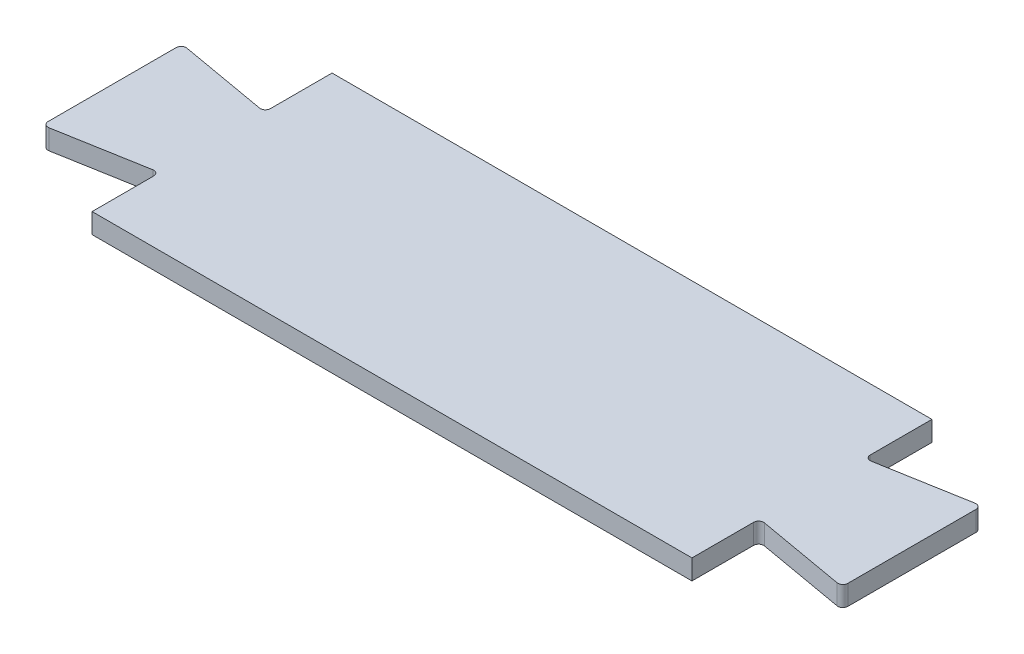
ISO-10303-21;
HEADER;
FILE_DESCRIPTION(('STEP AP214'),'2;1');
FILE_NAME('part.step','',(''),(''),'','','');
FILE_SCHEMA(('AUTOMOTIVE_DESIGN { 1 0 10303 214 1 1 1 1 }'));
ENDSEC;
DATA;
#1=APPLICATION_CONTEXT('core data for automotive mechanical design processes');
#2=APPLICATION_PROTOCOL_DEFINITION('international standard','automotive_design',2000,#1);
#3=PRODUCT_CONTEXT('',#1,'mechanical');
#4=PRODUCT('Part','Part','',(#3));
#5=PRODUCT_RELATED_PRODUCT_CATEGORY('part','',(#4));
#6=PRODUCT_DEFINITION_FORMATION('','',#4);
#7=PRODUCT_DEFINITION_CONTEXT('part definition',#1,'design');
#8=PRODUCT_DEFINITION('design','',#6,#7);
#9=PRODUCT_DEFINITION_SHAPE('','',#8);
#10=(LENGTH_UNIT() NAMED_UNIT(*) SI_UNIT(.MILLI.,.METRE.));
#11=(NAMED_UNIT(*) PLANE_ANGLE_UNIT() SI_UNIT($,.RADIAN.));
#12=(NAMED_UNIT(*) SI_UNIT($,.STERADIAN.) SOLID_ANGLE_UNIT());
#13=UNCERTAINTY_MEASURE_WITH_UNIT(LENGTH_MEASURE(1.E-05),#10,'distance_accuracy_value','');
#14=(GEOMETRIC_REPRESENTATION_CONTEXT(3) GLOBAL_UNCERTAINTY_ASSIGNED_CONTEXT((#13)) GLOBAL_UNIT_ASSIGNED_CONTEXT((#10,
#11,#12)) REPRESENTATION_CONTEXT('',''));
#15=CARTESIAN_POINT('',(0.,0.,0.));
#16=DIRECTION('',(0.,0.,1.));
#17=DIRECTION('',(1.,0.,0.));
#18=AXIS2_PLACEMENT_3D('',#15,#16,#17);
#19=CARTESIAN_POINT('',(15.,1.,-2.61836509645766));
#20=DIRECTION('',(-1.,0.,0.));
#21=DIRECTION('',(0.,0.,1.));
#22=AXIS2_PLACEMENT_3D('',#19,#20,#21);
#23=PLANE('',#22);
#24=DIRECTION('',(0.,0.,-1.));
#25=VECTOR('',#24,1.);
#26=CARTESIAN_POINT('',(15.,1.,-2.61836509645766));
#27=LINE('',#26,#25);
#28=CARTESIAN_POINT('',(15.,1.,-2.91630349460621));
#29=VERTEX_POINT('',#28);
#30=CARTESIAN_POINT('',(15.,1.,-6.));
#31=VERTEX_POINT('',#30);
#32=EDGE_CURVE('E169',#29,#31,#27,.T.);
#33=ORIENTED_EDGE('',*,*,#32,.F.);
#34=DIRECTION('',(0.,-1.,0.));
#35=VECTOR('',#34,1.);
#36=CARTESIAN_POINT('',(15.,0.,-2.91630349460621));
#37=LINE('',#36,#35);
#38=CARTESIAN_POINT('',(15.,0.,-2.91630349460621));
#39=VERTEX_POINT('',#38);
#40=EDGE_CURVE('E236',#29,#39,#37,.T.);
#41=ORIENTED_EDGE('',*,*,#40,.T.);
#42=DIRECTION('',(0.,0.,-1.));
#43=VECTOR('',#42,1.);
#44=CARTESIAN_POINT('',(15.,0.,-2.61836509645766));
#45=LINE('',#44,#43);
#46=CARTESIAN_POINT('',(15.,0.,-6.));
#47=VERTEX_POINT('',#46);
#48=EDGE_CURVE('E194',#39,#47,#45,.T.);
#49=ORIENTED_EDGE('',*,*,#48,.T.);
#50=DIRECTION('',(0.,-1.,0.));
#51=VECTOR('',#50,1.);
#52=CARTESIAN_POINT('',(15.,1.,-6.));
#53=LINE('',#52,#51);
#54=EDGE_CURVE('E187',#31,#47,#53,.T.);
#55=ORIENTED_EDGE('',*,*,#54,.F.);
#56=EDGE_LOOP('',(#33,#41,#49,#55));
#57=FACE_BOUND('',#56,.T.);
#58=ADVANCED_FACE('F33',(#57),#23,.F.);
#59=CARTESIAN_POINT('',(-15.,1.,-6.));
#60=DIRECTION('',(0.,0.,1.));
#61=DIRECTION('',(1.,0.,0.));
#62=AXIS2_PLACEMENT_3D('',#59,#60,#61);
#63=PLANE('',#62);
#64=DIRECTION('',(-1.,0.,0.));
#65=VECTOR('',#64,1.);
#66=CARTESIAN_POINT('',(-15.,0.,-6.));
#67=LINE('',#66,#65);
#68=CARTESIAN_POINT('',(-15.,0.,-6.));
#69=VERTEX_POINT('',#68);
#70=EDGE_CURVE('E305',#47,#69,#67,.T.);
#71=ORIENTED_EDGE('',*,*,#70,.T.);
#72=DIRECTION('',(0.,-1.,0.));
#73=VECTOR('',#72,1.);
#74=CARTESIAN_POINT('',(-15.,1.,-6.));
#75=LINE('',#74,#73);
#76=CARTESIAN_POINT('',(-15.,1.,-6.));
#77=VERTEX_POINT('',#76);
#78=EDGE_CURVE('E189',#77,#69,#75,.T.);
#79=ORIENTED_EDGE('',*,*,#78,.F.);
#80=DIRECTION('',(-1.,0.,0.));
#81=VECTOR('',#80,1.);
#82=CARTESIAN_POINT('',(-15.,1.,-6.));
#83=LINE('',#82,#81);
#84=EDGE_CURVE('E174',#31,#77,#83,.T.);
#85=ORIENTED_EDGE('',*,*,#84,.F.);
#86=ORIENTED_EDGE('',*,*,#54,.T.);
#87=EDGE_LOOP('',(#71,#79,#85,#86));
#88=FACE_BOUND('',#87,.T.);
#89=ADVANCED_FACE('F186',(#88),#63,.F.);
#90=CARTESIAN_POINT('',(-15.,1.,-2.61836509645765));
#91=DIRECTION('',(1.,0.,0.));
#92=DIRECTION('',(0.,0.,-1.));
#93=AXIS2_PLACEMENT_3D('',#90,#91,#92);
#94=PLANE('',#93);
#95=DIRECTION('',(0.,0.,1.));
#96=VECTOR('',#95,1.);
#97=CARTESIAN_POINT('',(-15.,0.,-2.61836509645765));
#98=LINE('',#97,#96);
#99=CARTESIAN_POINT('',(-15.,0.,-2.91630349460621));
#100=VERTEX_POINT('',#99);
#101=EDGE_CURVE('E307',#69,#100,#98,.T.);
#102=ORIENTED_EDGE('',*,*,#101,.T.);
#103=DIRECTION('',(0.,-1.,0.));
#104=VECTOR('',#103,1.);
#105=CARTESIAN_POINT('',(-15.,1.,-2.91630349460621));
#106=LINE('',#105,#104);
#107=CARTESIAN_POINT('',(-15.,1.,-2.91630349460621));
#108=VERTEX_POINT('',#107);
#109=EDGE_CURVE('E234',#100,#108,#106,.F.);
#110=ORIENTED_EDGE('',*,*,#109,.T.);
#111=DIRECTION('',(0.,0.,1.));
#112=VECTOR('',#111,1.);
#113=CARTESIAN_POINT('',(-15.,1.,-2.61836509645765));
#114=LINE('',#113,#112);
#115=EDGE_CURVE('E191',#77,#108,#114,.T.);
#116=ORIENTED_EDGE('',*,*,#115,.F.);
#117=ORIENTED_EDGE('',*,*,#78,.T.);
#118=EDGE_LOOP('',(#102,#110,#116,#117));
#119=FACE_BOUND('',#118,.T.);
#120=ADVANCED_FACE('F393',(#119),#94,.F.);
#121=CARTESIAN_POINT('',(-15.,1.,-2.61836509645765));
#122=DIRECTION('',(-0.173648177666934,0.,0.984807753012207));
#123=DIRECTION('',(0.984807753012208,0.,0.173648177666934));
#124=AXIS2_PLACEMENT_3D('',#121,#122,#123);
#125=PLANE('',#124);
#126=DIRECTION('',(-0.984807753012207,0.,-0.173648177666934));
#127=VECTOR('',#126,1.);
#128=CARTESIAN_POINT('',(-15.,0.,-2.61836509645765));
#129=LINE('',#128,#127);
#130=CARTESIAN_POINT('',(-15.2934120444167,0.,-2.67010155635316));
#131=VERTEX_POINT('',#130);
#132=CARTESIAN_POINT('',(-19.7065879555833,0.,-3.4482635401045));
#133=VERTEX_POINT('',#132);
#134=EDGE_CURVE('E310',#131,#133,#129,.T.);
#135=ORIENTED_EDGE('',*,*,#134,.T.);
#136=DIRECTION('',(0.,-1.,0.));
#137=VECTOR('',#136,1.);
#138=CARTESIAN_POINT('',(-19.7065879555833,1.,-3.4482635401045));
#139=LINE('',#138,#137);
#140=CARTESIAN_POINT('',(-19.7065879555833,1.,-3.4482635401045));
#141=VERTEX_POINT('',#140);
#142=EDGE_CURVE('E232',#133,#141,#139,.F.);
#143=ORIENTED_EDGE('',*,*,#142,.T.);
#144=DIRECTION('',(-0.984807753012207,0.,-0.173648177666934));
#145=VECTOR('',#144,1.);
#146=CARTESIAN_POINT('',(-15.,1.,-2.61836509645765));
#147=LINE('',#146,#145);
#148=CARTESIAN_POINT('',(-15.2934120444167,1.,-2.67010155635316));
#149=VERTEX_POINT('',#148);
#150=EDGE_CURVE('E352',#149,#141,#147,.T.);
#151=ORIENTED_EDGE('',*,*,#150,.F.);
#152=DIRECTION('',(0.,-1.,0.));
#153=VECTOR('',#152,1.);
#154=CARTESIAN_POINT('',(-15.2934120444167,0.,-2.67010155635316));
#155=LINE('',#154,#153);
#156=EDGE_CURVE('E229',#149,#131,#155,.T.);
#157=ORIENTED_EDGE('',*,*,#156,.T.);
#158=EDGE_LOOP('',(#135,#143,#151,#157));
#159=FACE_BOUND('',#158,.T.);
#160=ADVANCED_FACE('F366',(#159),#125,.F.);
#161=CARTESIAN_POINT('',(-20.,1.,-3.5));
#162=DIRECTION('',(1.,0.,0.));
#163=DIRECTION('',(0.,0.,-1.));
#164=AXIS2_PLACEMENT_3D('',#161,#162,#163);
#165=PLANE('',#164);
#166=DIRECTION('',(0.,0.,1.));
#167=VECTOR('',#166,1.);
#168=CARTESIAN_POINT('',(-20.,0.,-3.5));
#169=LINE('',#168,#167);
#170=CARTESIAN_POINT('',(-20.,0.,-3.20206160185145));
#171=VERTEX_POINT('',#170);
#172=CARTESIAN_POINT('',(-20.,0.,3.20206160185145));
#173=VERTEX_POINT('',#172);
#174=EDGE_CURVE('E313',#171,#173,#169,.T.);
#175=ORIENTED_EDGE('',*,*,#174,.T.);
#176=DIRECTION('',(0.,-1.,0.));
#177=VECTOR('',#176,1.);
#178=CARTESIAN_POINT('',(-20.,1.,3.20206160185145));
#179=LINE('',#178,#177);
#180=CARTESIAN_POINT('',(-20.,1.,3.20206160185145));
#181=VERTEX_POINT('',#180);
#182=EDGE_CURVE('E220',#173,#181,#179,.F.);
#183=ORIENTED_EDGE('',*,*,#182,.T.);
#184=DIRECTION('',(0.,0.,1.));
#185=VECTOR('',#184,1.);
#186=CARTESIAN_POINT('',(-20.,1.,-3.5));
#187=LINE('',#186,#185);
#188=CARTESIAN_POINT('',(-20.,1.,-3.20206160185145));
#189=VERTEX_POINT('',#188);
#190=EDGE_CURVE('E349',#189,#181,#187,.T.);
#191=ORIENTED_EDGE('',*,*,#190,.F.);
#192=DIRECTION('',(0.,-1.,0.));
#193=VECTOR('',#192,1.);
#194=CARTESIAN_POINT('',(-20.,1.,-3.20206160185145));
#195=LINE('',#194,#193);
#196=EDGE_CURVE('E217',#189,#171,#195,.T.);
#197=ORIENTED_EDGE('',*,*,#196,.T.);
#198=EDGE_LOOP('',(#175,#183,#191,#197));
#199=FACE_BOUND('',#198,.T.);
#200=ADVANCED_FACE('F376',(#199),#165,.F.);
#201=CARTESIAN_POINT('',(-15.,1.,2.61836509645765));
#202=DIRECTION('',(-0.173648177666935,0.,-0.984807753012207));
#203=DIRECTION('',(-0.984807753012207,0.,0.173648177666935));
#204=AXIS2_PLACEMENT_3D('',#201,#202,#203);
#205=PLANE('',#204);
#206=DIRECTION('',(0.984807753012207,0.,-0.173648177666935));
#207=VECTOR('',#206,1.);
#208=CARTESIAN_POINT('',(-15.,0.,2.61836509645765));
#209=LINE('',#208,#207);
#210=CARTESIAN_POINT('',(-19.7065879555833,0.,3.4482635401045));
#211=VERTEX_POINT('',#210);
#212=CARTESIAN_POINT('',(-15.2934120444167,0.,2.67010155635316));
#213=VERTEX_POINT('',#212);
#214=EDGE_CURVE('E316',#211,#213,#209,.T.);
#215=ORIENTED_EDGE('',*,*,#214,.T.);
#216=DIRECTION('',(0.,-1.,0.));
#217=VECTOR('',#216,1.);
#218=CARTESIAN_POINT('',(-15.2934120444167,1.,2.67010155635316));
#219=LINE('',#218,#217);
#220=CARTESIAN_POINT('',(-15.2934120444167,1.,2.67010155635316));
#221=VERTEX_POINT('',#220);
#222=EDGE_CURVE('E207',#213,#221,#219,.F.);
#223=ORIENTED_EDGE('',*,*,#222,.T.);
#224=DIRECTION('',(0.984807753012207,0.,-0.173648177666935));
#225=VECTOR('',#224,1.);
#226=CARTESIAN_POINT('',(-15.,1.,2.61836509645765));
#227=LINE('',#226,#225);
#228=CARTESIAN_POINT('',(-19.7065879555833,1.,3.4482635401045));
#229=VERTEX_POINT('',#228);
#230=EDGE_CURVE('E346',#229,#221,#227,.T.);
#231=ORIENTED_EDGE('',*,*,#230,.F.);
#232=DIRECTION('',(0.,-1.,0.));
#233=VECTOR('',#232,1.);
#234=CARTESIAN_POINT('',(-19.7065879555833,1.,3.4482635401045));
#235=LINE('',#234,#233);
#236=EDGE_CURVE('E199',#229,#211,#235,.T.);
#237=ORIENTED_EDGE('',*,*,#236,.T.);
#238=EDGE_LOOP('',(#215,#223,#231,#237));
#239=FACE_BOUND('',#238,.T.);
#240=ADVANCED_FACE('F345',(#239),#205,.F.);
#241=CARTESIAN_POINT('',(-15.,1.,6.));
#242=DIRECTION('',(1.,0.,0.));
#243=DIRECTION('',(0.,0.,-1.));
#244=AXIS2_PLACEMENT_3D('',#241,#242,#243);
#245=PLANE('',#244);
#246=DIRECTION('',(0.,0.,1.));
#247=VECTOR('',#246,1.);
#248=CARTESIAN_POINT('',(-15.,1.,6.));
#249=LINE('',#248,#247);
#250=CARTESIAN_POINT('',(-15.,1.,2.91630349460621));
#251=VERTEX_POINT('',#250);
#252=CARTESIAN_POINT('',(-15.,1.,6.));
#253=VERTEX_POINT('',#252);
#254=EDGE_CURVE('E337',#251,#253,#249,.T.);
#255=ORIENTED_EDGE('',*,*,#254,.F.);
#256=DIRECTION('',(0.,-1.,0.));
#257=VECTOR('',#256,1.);
#258=CARTESIAN_POINT('',(-15.,0.,2.91630349460621));
#259=LINE('',#258,#257);
#260=CARTESIAN_POINT('',(-15.,0.,2.91630349460621));
#261=VERTEX_POINT('',#260);
#262=EDGE_CURVE('E196',#251,#261,#259,.T.);
#263=ORIENTED_EDGE('',*,*,#262,.T.);
#264=DIRECTION('',(0.,0.,1.));
#265=VECTOR('',#264,1.);
#266=CARTESIAN_POINT('',(-15.,0.,6.));
#267=LINE('',#266,#265);
#268=CARTESIAN_POINT('',(-15.,0.,6.));
#269=VERTEX_POINT('',#268);
#270=EDGE_CURVE('E319',#261,#269,#267,.T.);
#271=ORIENTED_EDGE('',*,*,#270,.T.);
#272=DIRECTION('',(0.,-1.,0.));
#273=VECTOR('',#272,1.);
#274=CARTESIAN_POINT('',(-15.,1.,6.));
#275=LINE('',#274,#273);
#276=EDGE_CURVE('E201',#253,#269,#275,.T.);
#277=ORIENTED_EDGE('',*,*,#276,.F.);
#278=EDGE_LOOP('',(#255,#263,#271,#277));
#279=FACE_BOUND('',#278,.T.);
#280=ADVANCED_FACE('F335',(#279),#245,.F.);
#281=CARTESIAN_POINT('',(-15.,1.,6.));
#282=DIRECTION('',(0.,0.,-1.));
#283=DIRECTION('',(-1.,0.,0.));
#284=AXIS2_PLACEMENT_3D('',#281,#282,#283);
#285=PLANE('',#284);
#286=DIRECTION('',(1.,0.,0.));
#287=VECTOR('',#286,1.);
#288=CARTESIAN_POINT('',(-15.,0.,6.));
#289=LINE('',#288,#287);
#290=CARTESIAN_POINT('',(15.,0.,6.));
#291=VERTEX_POINT('',#290);
#292=EDGE_CURVE('E284',#269,#291,#289,.T.);
#293=ORIENTED_EDGE('',*,*,#292,.T.);
#294=DIRECTION('',(0.,-1.,0.));
#295=VECTOR('',#294,1.);
#296=CARTESIAN_POINT('',(15.,1.,6.));
#297=LINE('',#296,#295);
#298=CARTESIAN_POINT('',(15.,1.,6.));
#299=VERTEX_POINT('',#298);
#300=EDGE_CURVE('E283',#299,#291,#297,.T.);
#301=ORIENTED_EDGE('',*,*,#300,.F.);
#302=DIRECTION('',(1.,0.,0.));
#303=VECTOR('',#302,1.);
#304=CARTESIAN_POINT('',(-15.,1.,6.));
#305=LINE('',#304,#303);
#306=EDGE_CURVE('E299',#253,#299,#305,.T.);
#307=ORIENTED_EDGE('',*,*,#306,.F.);
#308=ORIENTED_EDGE('',*,*,#276,.T.);
#309=EDGE_LOOP('',(#293,#301,#307,#308));
#310=FACE_BOUND('',#309,.T.);
#311=ADVANCED_FACE('F331',(#310),#285,.F.);
#312=CARTESIAN_POINT('',(15.,1.,6.));
#313=DIRECTION('',(-1.,0.,0.));
#314=DIRECTION('',(0.,0.,1.));
#315=AXIS2_PLACEMENT_3D('',#312,#313,#314);
#316=PLANE('',#315);
#317=DIRECTION('',(0.,0.,-1.));
#318=VECTOR('',#317,1.);
#319=CARTESIAN_POINT('',(15.,0.,6.));
#320=LINE('',#319,#318);
#321=CARTESIAN_POINT('',(15.,0.,2.91630349460621));
#322=VERTEX_POINT('',#321);
#323=EDGE_CURVE('E271',#291,#322,#320,.T.);
#324=ORIENTED_EDGE('',*,*,#323,.T.);
#325=DIRECTION('',(0.,-1.,0.));
#326=VECTOR('',#325,1.);
#327=CARTESIAN_POINT('',(15.,1.,2.91630349460621));
#328=LINE('',#327,#326);
#329=CARTESIAN_POINT('',(15.,1.,2.91630349460621));
#330=VERTEX_POINT('',#329);
#331=EDGE_CURVE('E252',#322,#330,#328,.F.);
#332=ORIENTED_EDGE('',*,*,#331,.T.);
#333=DIRECTION('',(0.,0.,-1.));
#334=VECTOR('',#333,1.);
#335=CARTESIAN_POINT('',(15.,1.,6.));
#336=LINE('',#335,#334);
#337=EDGE_CURVE('E291',#299,#330,#336,.T.);
#338=ORIENTED_EDGE('',*,*,#337,.F.);
#339=ORIENTED_EDGE('',*,*,#300,.T.);
#340=EDGE_LOOP('',(#324,#332,#338,#339));
#341=FACE_BOUND('',#340,.T.);
#342=ADVANCED_FACE('F279',(#341),#316,.F.);
#343=CARTESIAN_POINT('',(15.,1.,2.61836509645765));
#344=DIRECTION('',(0.173648177666935,0.,-0.984807753012207));
#345=DIRECTION('',(-0.984807753012207,0.,-0.173648177666935));
#346=AXIS2_PLACEMENT_3D('',#343,#344,#345);
#347=PLANE('',#346);
#348=DIRECTION('',(0.984807753012207,0.,0.173648177666935));
#349=VECTOR('',#348,1.);
#350=CARTESIAN_POINT('',(15.,0.,2.61836509645765));
#351=LINE('',#350,#349);
#352=CARTESIAN_POINT('',(15.2934120444167,0.,2.67010155635316));
#353=VERTEX_POINT('',#352);
#354=CARTESIAN_POINT('',(19.7065879555833,0.,3.4482635401045));
#355=VERTEX_POINT('',#354);
#356=EDGE_CURVE('E273',#353,#355,#351,.T.);
#357=ORIENTED_EDGE('',*,*,#356,.T.);
#358=DIRECTION('',(0.,-1.,0.));
#359=VECTOR('',#358,1.);
#360=CARTESIAN_POINT('',(19.7065879555833,1.,3.4482635401045));
#361=LINE('',#360,#359);
#362=CARTESIAN_POINT('',(19.7065879555833,1.,3.4482635401045));
#363=VERTEX_POINT('',#362);
#364=EDGE_CURVE('E250',#355,#363,#361,.F.);
#365=ORIENTED_EDGE('',*,*,#364,.T.);
#366=DIRECTION('',(0.984807753012207,0.,0.173648177666935));
#367=VECTOR('',#366,1.);
#368=CARTESIAN_POINT('',(15.,1.,2.61836509645765));
#369=LINE('',#368,#367);
#370=CARTESIAN_POINT('',(15.2934120444167,1.,2.67010155635316));
#371=VERTEX_POINT('',#370);
#372=EDGE_CURVE('E289',#371,#363,#369,.T.);
#373=ORIENTED_EDGE('',*,*,#372,.F.);
#374=DIRECTION('',(0.,-1.,0.));
#375=VECTOR('',#374,1.);
#376=CARTESIAN_POINT('',(15.2934120444167,0.,2.67010155635316));
#377=LINE('',#376,#375);
#378=EDGE_CURVE('E247',#371,#353,#377,.T.);
#379=ORIENTED_EDGE('',*,*,#378,.T.);
#380=EDGE_LOOP('',(#357,#365,#373,#379));
#381=FACE_BOUND('',#380,.T.);
#382=ADVANCED_FACE('F293',(#381),#347,.F.);
#383=CARTESIAN_POINT('',(20.,1.,-3.50000000000001));
#384=DIRECTION('',(-1.,0.,0.));
#385=DIRECTION('',(0.,0.,1.));
#386=AXIS2_PLACEMENT_3D('',#383,#384,#385);
#387=PLANE('',#386);
#388=DIRECTION('',(0.,0.,-1.));
#389=VECTOR('',#388,1.);
#390=CARTESIAN_POINT('',(20.,0.,-3.50000000000001));
#391=LINE('',#390,#389);
#392=CARTESIAN_POINT('',(20.,0.,3.20206160185145));
#393=VERTEX_POINT('',#392);
#394=CARTESIAN_POINT('',(20.,0.,-3.20206160185145));
#395=VERTEX_POINT('',#394);
#396=EDGE_CURVE('E323',#393,#395,#391,.T.);
#397=ORIENTED_EDGE('',*,*,#396,.T.);
#398=DIRECTION('',(0.,-1.,0.));
#399=VECTOR('',#398,1.);
#400=CARTESIAN_POINT('',(20.,1.,-3.20206160185145));
#401=LINE('',#400,#399);
#402=CARTESIAN_POINT('',(20.,1.,-3.20206160185145));
#403=VERTEX_POINT('',#402);
#404=EDGE_CURVE('E245',#395,#403,#401,.F.);
#405=ORIENTED_EDGE('',*,*,#404,.T.);
#406=DIRECTION('',(0.,0.,-1.));
#407=VECTOR('',#406,1.);
#408=CARTESIAN_POINT('',(20.,1.,-3.50000000000001));
#409=LINE('',#408,#407);
#410=CARTESIAN_POINT('',(20.,1.,3.20206160185145));
#411=VERTEX_POINT('',#410);
#412=EDGE_CURVE('E295',#411,#403,#409,.T.);
#413=ORIENTED_EDGE('',*,*,#412,.F.);
#414=DIRECTION('',(0.,-1.,0.));
#415=VECTOR('',#414,1.);
#416=CARTESIAN_POINT('',(20.,1.,3.20206160185145));
#417=LINE('',#416,#415);
#418=EDGE_CURVE('E242',#411,#393,#417,.T.);
#419=ORIENTED_EDGE('',*,*,#418,.T.);
#420=EDGE_LOOP('',(#397,#405,#413,#419));
#421=FACE_BOUND('',#420,.T.);
#422=ADVANCED_FACE('F412',(#421),#387,.F.);
#423=CARTESIAN_POINT('',(15.,1.,-2.61836509645766));
#424=DIRECTION('',(0.173648177666935,0.,0.984807753012207));
#425=DIRECTION('',(0.984807753012207,0.,-0.173648177666935));
#426=AXIS2_PLACEMENT_3D('',#423,#424,#425);
#427=PLANE('',#426);
#428=DIRECTION('',(-0.984807753012207,0.,0.173648177666935));
#429=VECTOR('',#428,1.);
#430=CARTESIAN_POINT('',(15.,0.,-2.61836509645766));
#431=LINE('',#430,#429);
#432=CARTESIAN_POINT('',(19.7065879555833,0.,-3.44826354010451));
#433=VERTEX_POINT('',#432);
#434=CARTESIAN_POINT('',(15.2934120444167,0.,-2.67010155635316));
#435=VERTEX_POINT('',#434);
#436=EDGE_CURVE('E182',#433,#435,#431,.T.);
#437=ORIENTED_EDGE('',*,*,#436,.T.);
#438=DIRECTION('',(0.,-1.,0.));
#439=VECTOR('',#438,1.);
#440=CARTESIAN_POINT('',(15.2934120444167,1.,-2.67010155635316));
#441=LINE('',#440,#439);
#442=CARTESIAN_POINT('',(15.2934120444167,1.,-2.67010155635316));
#443=VERTEX_POINT('',#442);
#444=EDGE_CURVE('E48',#435,#443,#441,.F.);
#445=ORIENTED_EDGE('',*,*,#444,.T.);
#446=DIRECTION('',(-0.984807753012207,0.,0.173648177666935));
#447=VECTOR('',#446,1.);
#448=CARTESIAN_POINT('',(15.,1.,-2.61836509645766));
#449=LINE('',#448,#447);
#450=CARTESIAN_POINT('',(19.7065879555833,1.,-3.44826354010451));
#451=VERTEX_POINT('',#450);
#452=EDGE_CURVE('E297',#451,#443,#449,.T.);
#453=ORIENTED_EDGE('',*,*,#452,.F.);
#454=DIRECTION('',(0.,-1.,0.));
#455=VECTOR('',#454,1.);
#456=CARTESIAN_POINT('',(19.7065879555833,1.,-3.44826354010451));
#457=LINE('',#456,#455);
#458=EDGE_CURVE('E238',#451,#433,#457,.T.);
#459=ORIENTED_EDGE('',*,*,#458,.T.);
#460=EDGE_LOOP('',(#437,#445,#453,#459));
#461=FACE_BOUND('',#460,.T.);
#462=ADVANCED_FACE('F415',(#461),#427,.F.);
#463=CARTESIAN_POINT('',(0.,1.,0.));
#464=DIRECTION('',(0.,-1.,0.));
#465=DIRECTION('',(0.,0.,-1.));
#466=AXIS2_PLACEMENT_3D('',#463,#464,#465);
#467=PLANE('',#466);
#468=ORIENTED_EDGE('',*,*,#190,.T.);
#469=CARTESIAN_POINT('',(-19.75,1.,3.20206160185145));
#470=DIRECTION('',(0.,-1.,0.));
#471=DIRECTION('',(0.,0.,-1.));
#472=AXIS2_PLACEMENT_3D('',#469,#470,#471);
#473=CIRCLE('',#472,0.25);
#474=EDGE_CURVE('E227',#181,#229,#473,.F.);
#475=ORIENTED_EDGE('',*,*,#474,.T.);
#476=ORIENTED_EDGE('',*,*,#230,.T.);
#477=CARTESIAN_POINT('',(-15.25,1.,2.91630349460621));
#478=DIRECTION('',(0.,-1.,0.));
#479=DIRECTION('',(0.,0.,-1.));
#480=AXIS2_PLACEMENT_3D('',#477,#478,#479);
#481=CIRCLE('',#480,0.25);
#482=EDGE_CURVE('E256',#221,#251,#481,.T.);
#483=ORIENTED_EDGE('',*,*,#482,.T.);
#484=ORIENTED_EDGE('',*,*,#254,.T.);
#485=ORIENTED_EDGE('',*,*,#306,.T.);
#486=ORIENTED_EDGE('',*,*,#337,.T.);
#487=CARTESIAN_POINT('',(15.25,1.,2.91630349460621));
#488=DIRECTION('',(0.,-1.,0.));
#489=DIRECTION('',(0.,0.,-1.));
#490=AXIS2_PLACEMENT_3D('',#487,#488,#489);
#491=CIRCLE('',#490,0.25);
#492=EDGE_CURVE('E11',#330,#371,#491,.T.);
#493=ORIENTED_EDGE('',*,*,#492,.T.);
#494=ORIENTED_EDGE('',*,*,#372,.T.);
#495=CARTESIAN_POINT('',(19.75,1.,3.20206160185145));
#496=DIRECTION('',(0.,-1.,0.));
#497=DIRECTION('',(0.,0.,-1.));
#498=AXIS2_PLACEMENT_3D('',#495,#496,#497);
#499=CIRCLE('',#498,0.25);
#500=EDGE_CURVE('E222',#363,#411,#499,.F.);
#501=ORIENTED_EDGE('',*,*,#500,.T.);
#502=ORIENTED_EDGE('',*,*,#412,.T.);
#503=CARTESIAN_POINT('',(19.75,1.,-3.20206160185145));
#504=DIRECTION('',(0.,-1.,0.));
#505=DIRECTION('',(0.,0.,-1.));
#506=AXIS2_PLACEMENT_3D('',#503,#504,#505);
#507=CIRCLE('',#506,0.25);
#508=EDGE_CURVE('E55',#403,#451,#507,.F.);
#509=ORIENTED_EDGE('',*,*,#508,.T.);
#510=ORIENTED_EDGE('',*,*,#452,.T.);
#511=CARTESIAN_POINT('',(15.25,1.,-2.91630349460621));
#512=DIRECTION('',(0.,-1.,0.));
#513=DIRECTION('',(0.,0.,-1.));
#514=AXIS2_PLACEMENT_3D('',#511,#512,#513);
#515=CIRCLE('',#514,0.25);
#516=EDGE_CURVE('E177',#443,#29,#515,.T.);
#517=ORIENTED_EDGE('',*,*,#516,.T.);
#518=ORIENTED_EDGE('',*,*,#32,.T.);
#519=ORIENTED_EDGE('',*,*,#84,.T.);
#520=ORIENTED_EDGE('',*,*,#115,.T.);
#521=CARTESIAN_POINT('',(-15.25,1.,-2.91630349460621));
#522=DIRECTION('',(0.,-1.,0.));
#523=DIRECTION('',(0.,0.,-1.));
#524=AXIS2_PLACEMENT_3D('',#521,#522,#523);
#525=CIRCLE('',#524,0.25);
#526=EDGE_CURVE('E260',#108,#149,#525,.T.);
#527=ORIENTED_EDGE('',*,*,#526,.T.);
#528=ORIENTED_EDGE('',*,*,#150,.T.);
#529=CARTESIAN_POINT('',(-19.75,1.,-3.20206160185145));
#530=DIRECTION('',(0.,-1.,0.));
#531=DIRECTION('',(0.,0.,-1.));
#532=AXIS2_PLACEMENT_3D('',#529,#530,#531);
#533=CIRCLE('',#532,0.25);
#534=EDGE_CURVE('E225',#141,#189,#533,.F.);
#535=ORIENTED_EDGE('',*,*,#534,.T.);
#536=EDGE_LOOP('',(#468,#475,#476,#483,#484,#485,#486,#493,#494,#501,#502,#509,#510,#517,#518,
#519,#520,#527,#528,#535));
#537=FACE_BOUND('',#536,.T.);
#538=ADVANCED_FACE('F172',(#537),#467,.F.);
#539=CARTESIAN_POINT('',(0.,0.,0.));
#540=DIRECTION('',(0.,-1.,0.));
#541=DIRECTION('',(0.,0.,-1.));
#542=AXIS2_PLACEMENT_3D('',#539,#540,#541);
#543=PLANE('',#542);
#544=ORIENTED_EDGE('',*,*,#214,.F.);
#545=CARTESIAN_POINT('',(-19.75,0.,3.20206160185145));
#546=DIRECTION('',(0.,-1.,0.));
#547=DIRECTION('',(0.,0.,-1.));
#548=AXIS2_PLACEMENT_3D('',#545,#546,#547);
#549=CIRCLE('',#548,0.25);
#550=EDGE_CURVE('E215',#211,#173,#549,.T.);
#551=ORIENTED_EDGE('',*,*,#550,.T.);
#552=ORIENTED_EDGE('',*,*,#174,.F.);
#553=CARTESIAN_POINT('',(-19.75,0.,-3.20206160185145));
#554=DIRECTION('',(0.,-1.,0.));
#555=DIRECTION('',(0.,0.,-1.));
#556=AXIS2_PLACEMENT_3D('',#553,#554,#555);
#557=CIRCLE('',#556,0.25);
#558=EDGE_CURVE('E213',#171,#133,#557,.T.);
#559=ORIENTED_EDGE('',*,*,#558,.T.);
#560=ORIENTED_EDGE('',*,*,#134,.F.);
#561=CARTESIAN_POINT('',(-15.25,0.,-2.91630349460621));
#562=DIRECTION('',(0.,-1.,0.));
#563=DIRECTION('',(0.,0.,-1.));
#564=AXIS2_PLACEMENT_3D('',#561,#562,#563);
#565=CIRCLE('',#564,0.25);
#566=EDGE_CURVE('E258',#131,#100,#565,.F.);
#567=ORIENTED_EDGE('',*,*,#566,.T.);
#568=ORIENTED_EDGE('',*,*,#101,.F.);
#569=ORIENTED_EDGE('',*,*,#70,.F.);
#570=ORIENTED_EDGE('',*,*,#48,.F.);
#571=CARTESIAN_POINT('',(15.25,0.,-2.91630349460621));
#572=DIRECTION('',(0.,-1.,0.));
#573=DIRECTION('',(0.,0.,-1.));
#574=AXIS2_PLACEMENT_3D('',#571,#572,#573);
#575=CIRCLE('',#574,0.25);
#576=EDGE_CURVE('E262',#39,#435,#575,.F.);
#577=ORIENTED_EDGE('',*,*,#576,.T.);
#578=ORIENTED_EDGE('',*,*,#436,.F.);
#579=CARTESIAN_POINT('',(19.75,0.,-3.20206160185145));
#580=DIRECTION('',(0.,-1.,0.));
#581=DIRECTION('',(0.,0.,-1.));
#582=AXIS2_PLACEMENT_3D('',#579,#580,#581);
#583=CIRCLE('',#582,0.25);
#584=EDGE_CURVE('E211',#433,#395,#583,.T.);
#585=ORIENTED_EDGE('',*,*,#584,.T.);
#586=ORIENTED_EDGE('',*,*,#396,.F.);
#587=CARTESIAN_POINT('',(19.75,0.,3.20206160185145));
#588=DIRECTION('',(0.,-1.,0.));
#589=DIRECTION('',(0.,0.,-1.));
#590=AXIS2_PLACEMENT_3D('',#587,#588,#589);
#591=CIRCLE('',#590,0.25);
#592=EDGE_CURVE('E209',#393,#355,#591,.T.);
#593=ORIENTED_EDGE('',*,*,#592,.T.);
#594=ORIENTED_EDGE('',*,*,#356,.F.);
#595=CARTESIAN_POINT('',(15.25,0.,2.91630349460621));
#596=DIRECTION('',(0.,-1.,0.));
#597=DIRECTION('',(0.,0.,-1.));
#598=AXIS2_PLACEMENT_3D('',#595,#596,#597);
#599=CIRCLE('',#598,0.25);
#600=EDGE_CURVE('E41',#353,#322,#599,.F.);
#601=ORIENTED_EDGE('',*,*,#600,.T.);
#602=ORIENTED_EDGE('',*,*,#323,.F.);
#603=ORIENTED_EDGE('',*,*,#292,.F.);
#604=ORIENTED_EDGE('',*,*,#270,.F.);
#605=CARTESIAN_POINT('',(-15.25,0.,2.91630349460621));
#606=DIRECTION('',(0.,-1.,0.));
#607=DIRECTION('',(0.,0.,-1.));
#608=AXIS2_PLACEMENT_3D('',#605,#606,#607);
#609=CIRCLE('',#608,0.25);
#610=EDGE_CURVE('E254',#261,#213,#609,.F.);
#611=ORIENTED_EDGE('',*,*,#610,.T.);
#612=EDGE_LOOP('',(#544,#551,#552,#559,#560,#567,#568,#569,#570,#577,#578,#585,#586,#593,#594,
#601,#602,#603,#604,#611));
#613=FACE_BOUND('',#612,.T.);
#614=ADVANCED_FACE('F269',(#613),#543,.T.);
#615=CARTESIAN_POINT('',(-15.25,1.,2.91630349460621));
#616=DIRECTION('',(0.,1.,0.));
#617=DIRECTION('',(0.,0.,1.));
#618=AXIS2_PLACEMENT_3D('',#615,#616,#617);
#619=CYLINDRICAL_SURFACE('',#618,0.25);
#620=ORIENTED_EDGE('',*,*,#482,.F.);
#621=ORIENTED_EDGE('',*,*,#222,.F.);
#622=ORIENTED_EDGE('',*,*,#610,.F.);
#623=ORIENTED_EDGE('',*,*,#262,.F.);
#624=EDGE_LOOP('',(#620,#621,#622,#623));
#625=FACE_BOUND('',#624,.T.);
#626=ADVANCED_FACE('F340',(#625),#619,.F.);
#627=CARTESIAN_POINT('',(-19.75,1.,3.20206160185145));
#628=DIRECTION('',(0.,-1.,0.));
#629=DIRECTION('',(0.,0.,-1.));
#630=AXIS2_PLACEMENT_3D('',#627,#628,#629);
#631=CYLINDRICAL_SURFACE('',#630,0.25);
#632=ORIENTED_EDGE('',*,*,#474,.F.);
#633=ORIENTED_EDGE('',*,*,#182,.F.);
#634=ORIENTED_EDGE('',*,*,#550,.F.);
#635=ORIENTED_EDGE('',*,*,#236,.F.);
#636=EDGE_LOOP('',(#632,#633,#634,#635));
#637=FACE_BOUND('',#636,.T.);
#638=ADVANCED_FACE('F379',(#637),#631,.T.);
#639=CARTESIAN_POINT('',(-19.75,1.,-3.20206160185145));
#640=DIRECTION('',(0.,-1.,0.));
#641=DIRECTION('',(0.,0.,-1.));
#642=AXIS2_PLACEMENT_3D('',#639,#640,#641);
#643=CYLINDRICAL_SURFACE('',#642,0.25);
#644=ORIENTED_EDGE('',*,*,#534,.F.);
#645=ORIENTED_EDGE('',*,*,#142,.F.);
#646=ORIENTED_EDGE('',*,*,#558,.F.);
#647=ORIENTED_EDGE('',*,*,#196,.F.);
#648=EDGE_LOOP('',(#644,#645,#646,#647));
#649=FACE_BOUND('',#648,.T.);
#650=ADVANCED_FACE('F373',(#649),#643,.T.);
#651=CARTESIAN_POINT('',(-15.25,1.,-2.91630349460621));
#652=DIRECTION('',(0.,1.,0.));
#653=DIRECTION('',(0.,0.,1.));
#654=AXIS2_PLACEMENT_3D('',#651,#652,#653);
#655=CYLINDRICAL_SURFACE('',#654,0.25);
#656=ORIENTED_EDGE('',*,*,#526,.F.);
#657=ORIENTED_EDGE('',*,*,#109,.F.);
#658=ORIENTED_EDGE('',*,*,#566,.F.);
#659=ORIENTED_EDGE('',*,*,#156,.F.);
#660=EDGE_LOOP('',(#656,#657,#658,#659));
#661=FACE_BOUND('',#660,.T.);
#662=ADVANCED_FACE('F363',(#661),#655,.F.);
#663=CARTESIAN_POINT('',(15.25,1.,-2.91630349460621));
#664=DIRECTION('',(0.,1.,0.));
#665=DIRECTION('',(0.,0.,1.));
#666=AXIS2_PLACEMENT_3D('',#663,#664,#665);
#667=CYLINDRICAL_SURFACE('',#666,0.25);
#668=ORIENTED_EDGE('',*,*,#516,.F.);
#669=ORIENTED_EDGE('',*,*,#444,.F.);
#670=ORIENTED_EDGE('',*,*,#576,.F.);
#671=ORIENTED_EDGE('',*,*,#40,.F.);
#672=EDGE_LOOP('',(#668,#669,#670,#671));
#673=FACE_BOUND('',#672,.T.);
#674=ADVANCED_FACE('F453',(#673),#667,.F.);
#675=CARTESIAN_POINT('',(19.75,1.,-3.20206160185145));
#676=DIRECTION('',(0.,-1.,0.));
#677=DIRECTION('',(0.,0.,-1.));
#678=AXIS2_PLACEMENT_3D('',#675,#676,#677);
#679=CYLINDRICAL_SURFACE('',#678,0.25);
#680=ORIENTED_EDGE('',*,*,#508,.F.);
#681=ORIENTED_EDGE('',*,*,#404,.F.);
#682=ORIENTED_EDGE('',*,*,#584,.F.);
#683=ORIENTED_EDGE('',*,*,#458,.F.);
#684=EDGE_LOOP('',(#680,#681,#682,#683));
#685=FACE_BOUND('',#684,.T.);
#686=ADVANCED_FACE('F462',(#685),#679,.T.);
#687=CARTESIAN_POINT('',(19.75,1.,3.20206160185145));
#688=DIRECTION('',(0.,-1.,0.));
#689=DIRECTION('',(0.,0.,-1.));
#690=AXIS2_PLACEMENT_3D('',#687,#688,#689);
#691=CYLINDRICAL_SURFACE('',#690,0.25);
#692=ORIENTED_EDGE('',*,*,#500,.F.);
#693=ORIENTED_EDGE('',*,*,#364,.F.);
#694=ORIENTED_EDGE('',*,*,#592,.F.);
#695=ORIENTED_EDGE('',*,*,#418,.F.);
#696=EDGE_LOOP('',(#692,#693,#694,#695));
#697=FACE_BOUND('',#696,.T.);
#698=ADVANCED_FACE('F472',(#697),#691,.T.);
#699=CARTESIAN_POINT('',(15.25,1.,2.91630349460621));
#700=DIRECTION('',(0.,1.,0.));
#701=DIRECTION('',(0.,0.,1.));
#702=AXIS2_PLACEMENT_3D('',#699,#700,#701);
#703=CYLINDRICAL_SURFACE('',#702,0.25);
#704=ORIENTED_EDGE('',*,*,#492,.F.);
#705=ORIENTED_EDGE('',*,*,#331,.F.);
#706=ORIENTED_EDGE('',*,*,#600,.F.);
#707=ORIENTED_EDGE('',*,*,#378,.F.);
#708=EDGE_LOOP('',(#704,#705,#706,#707));
#709=FACE_BOUND('',#708,.T.);
#710=ADVANCED_FACE('F35',(#709),#703,.F.);
#711=CLOSED_SHELL('',(#58,#89,#120,#160,#200,#240,#280,#311,#342,#382,#422,#462,#538,#614,#626,
#638,#650,#662,#674,#686,#698,#710));
#712=MANIFOLD_SOLID_BREP('B2',#711);
#713=ADVANCED_BREP_SHAPE_REPRESENTATION('',(#18,#712),#14);
#714=SHAPE_DEFINITION_REPRESENTATION(#9,#713);
ENDSEC;
END-ISO-10303-21;
